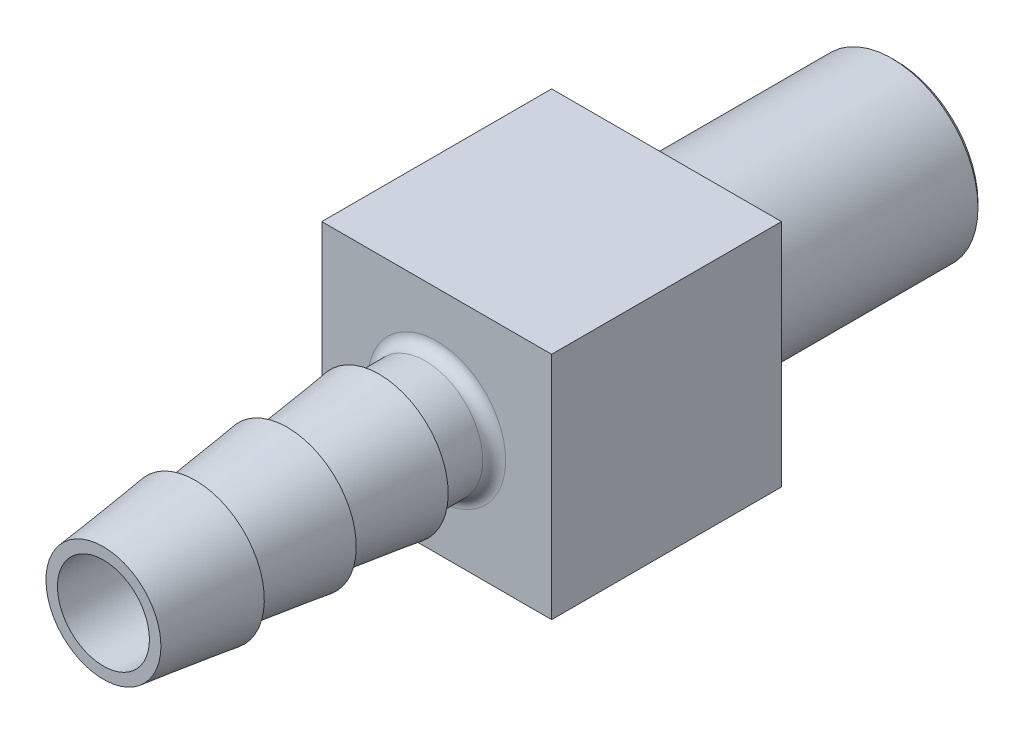
ISO-10303-21;
HEADER;
FILE_DESCRIPTION(('STEP AP214'),'2;1');
FILE_NAME('part.step','',(''),(''),'','','');
FILE_SCHEMA(('AUTOMOTIVE_DESIGN { 1 0 10303 214 1 1 1 1 }'));
ENDSEC;
DATA;
#1=APPLICATION_CONTEXT('core data for automotive mechanical design processes');
#2=APPLICATION_PROTOCOL_DEFINITION('international standard','automotive_design',2000,#1);
#3=PRODUCT_CONTEXT('',#1,'mechanical');
#4=PRODUCT('Part','Part','',(#3));
#5=PRODUCT_RELATED_PRODUCT_CATEGORY('part','',(#4));
#6=PRODUCT_DEFINITION_FORMATION('','',#4);
#7=PRODUCT_DEFINITION_CONTEXT('part definition',#1,'design');
#8=PRODUCT_DEFINITION('design','',#6,#7);
#9=PRODUCT_DEFINITION_SHAPE('','',#8);
#10=(LENGTH_UNIT() NAMED_UNIT(*) SI_UNIT(.MILLI.,.METRE.));
#11=(NAMED_UNIT(*) PLANE_ANGLE_UNIT() SI_UNIT($,.RADIAN.));
#12=(NAMED_UNIT(*) SI_UNIT($,.STERADIAN.) SOLID_ANGLE_UNIT());
#13=UNCERTAINTY_MEASURE_WITH_UNIT(LENGTH_MEASURE(1.E-05),#10,'distance_accuracy_value','');
#14=(GEOMETRIC_REPRESENTATION_CONTEXT(3) GLOBAL_UNCERTAINTY_ASSIGNED_CONTEXT((#13)) GLOBAL_UNIT_ASSIGNED_CONTEXT((#10,
#11,#12)) REPRESENTATION_CONTEXT('',''));
#15=CARTESIAN_POINT('',(0.,0.,0.));
#16=DIRECTION('',(0.,0.,1.));
#17=DIRECTION('',(1.,0.,0.));
#18=AXIS2_PLACEMENT_3D('',#15,#16,#17);
#19=CARTESIAN_POINT('',(0.,0.,12.7));
#20=DIRECTION('',(0.,0.,-1.));
#21=DIRECTION('',(-1.,0.,0.));
#22=AXIS2_PLACEMENT_3D('',#19,#20,#21);
#23=CYLINDRICAL_SURFACE('',#22,4.7625);
#24=CARTESIAN_POINT('',(0.,0.,12.065));
#25=DIRECTION('',(0.,0.,1.));
#26=DIRECTION('',(1.,0.,0.));
#27=AXIS2_PLACEMENT_3D('',#24,#25,#26);
#28=CIRCLE('',#27,4.7625);
#29=CARTESIAN_POINT('',(4.7625,0.,12.065));
#30=VERTEX_POINT('',#29);
#31=EDGE_CURVE('E11',#30,#30,#28,.F.);
#32=ORIENTED_EDGE('',*,*,#31,.T.);
#33=EDGE_LOOP('',(#32));
#34=FACE_BOUND('',#33,.T.);
#35=CARTESIAN_POINT('',(0.,0.,0.253999999999997));
#36=DIRECTION('',(0.,0.,1.));
#37=DIRECTION('',(1.,0.,0.));
#38=AXIS2_PLACEMENT_3D('',#35,#36,#37);
#39=CIRCLE('',#38,4.7625);
#40=CARTESIAN_POINT('',(4.7625,0.,0.253999999999997));
#41=VERTEX_POINT('',#40);
#42=EDGE_CURVE('E115',#41,#41,#39,.T.);
#43=ORIENTED_EDGE('',*,*,#42,.T.);
#44=EDGE_LOOP('',(#43));
#45=FACE_BOUND('',#44,.T.);
#46=ADVANCED_FACE('F36',(#34,#45),#23,.T.);
#47=CARTESIAN_POINT('',(0.,0.,0.));
#48=DIRECTION('',(0.,0.,1.));
#49=DIRECTION('',(1.,0.,0.));
#50=AXIS2_PLACEMENT_3D('',#47,#48,#49);
#51=PLANE('',#50);
#52=CARTESIAN_POINT('',(0.,0.,0.));
#53=DIRECTION('',(0.,0.,-1.));
#54=DIRECTION('',(-1.,0.,0.));
#55=AXIS2_PLACEMENT_3D('',#52,#53,#54);
#56=CIRCLE('',#55,3.175);
#57=CARTESIAN_POINT('',(-3.175,0.,0.));
#58=VERTEX_POINT('',#57);
#59=EDGE_CURVE('E316',#58,#58,#56,.T.);
#60=ORIENTED_EDGE('',*,*,#59,.F.);
#61=EDGE_LOOP('',(#60));
#62=FACE_BOUND('',#61,.T.);
#63=CARTESIAN_POINT('',(0.,0.,0.));
#64=DIRECTION('',(0.,0.,1.));
#65=DIRECTION('',(1.,0.,0.));
#66=AXIS2_PLACEMENT_3D('',#63,#64,#65);
#67=CIRCLE('',#66,4.5085);
#68=CARTESIAN_POINT('',(4.5085,0.,0.));
#69=VERTEX_POINT('',#68);
#70=EDGE_CURVE('E118',#69,#69,#67,.F.);
#71=ORIENTED_EDGE('',*,*,#70,.T.);
#72=EDGE_LOOP('',(#71));
#73=FACE_BOUND('',#72,.T.);
#74=ADVANCED_FACE('F148',(#62,#73),#51,.F.);
#75=CARTESIAN_POINT('',(0.,0.,0.253999999999997));
#76=DIRECTION('',(0.,0.,1.));
#77=DIRECTION('',(1.,0.,0.));
#78=AXIS2_PLACEMENT_3D('',#75,#76,#77);
#79=CONICAL_SURFACE('',#78,4.7625,0.785398163397453);
#80=ORIENTED_EDGE('',*,*,#70,.F.);
#81=EDGE_LOOP('',(#80));
#82=FACE_BOUND('',#81,.T.);
#83=ORIENTED_EDGE('',*,*,#42,.F.);
#84=EDGE_LOOP('',(#83));
#85=FACE_BOUND('',#84,.T.);
#86=ADVANCED_FACE('F154',(#82,#85),#79,.T.);
#87=CARTESIAN_POINT('',(-6.35,-6.35,12.7));
#88=DIRECTION('',(0.,0.,1.));
#89=DIRECTION('',(1.,0.,0.));
#90=AXIS2_PLACEMENT_3D('',#87,#88,#89);
#91=PLANE('',#90);
#92=CARTESIAN_POINT('',(0.,0.,12.7));
#93=DIRECTION('',(0.,0.,1.));
#94=DIRECTION('',(1.,0.,0.));
#95=AXIS2_PLACEMENT_3D('',#92,#93,#94);
#96=CIRCLE('',#95,5.3975);
#97=CARTESIAN_POINT('',(5.3975,0.,12.7));
#98=VERTEX_POINT('',#97);
#99=EDGE_CURVE('E46',#98,#98,#96,.T.);
#100=ORIENTED_EDGE('',*,*,#99,.T.);
#101=EDGE_LOOP('',(#100));
#102=FACE_BOUND('',#101,.T.);
#103=DIRECTION('',(0.,-1.,0.));
#104=VECTOR('',#103,1.);
#105=CARTESIAN_POINT('',(-6.35,6.35,12.7));
#106=LINE('',#105,#104);
#107=CARTESIAN_POINT('',(-6.35,6.35,12.7));
#108=VERTEX_POINT('',#107);
#109=CARTESIAN_POINT('',(-6.35,-6.35,12.7));
#110=VERTEX_POINT('',#109);
#111=EDGE_CURVE('E105',#108,#110,#106,.T.);
#112=ORIENTED_EDGE('',*,*,#111,.F.);
#113=DIRECTION('',(-1.,0.,0.));
#114=VECTOR('',#113,1.);
#115=CARTESIAN_POINT('',(-6.35,6.35,12.7));
#116=LINE('',#115,#114);
#117=CARTESIAN_POINT('',(6.35,6.35,12.7));
#118=VERTEX_POINT('',#117);
#119=EDGE_CURVE('E77',#118,#108,#116,.T.);
#120=ORIENTED_EDGE('',*,*,#119,.F.);
#121=DIRECTION('',(0.,1.,0.));
#122=VECTOR('',#121,1.);
#123=CARTESIAN_POINT('',(6.35,6.35,12.7));
#124=LINE('',#123,#122);
#125=CARTESIAN_POINT('',(6.35,-6.35,12.7));
#126=VERTEX_POINT('',#125);
#127=EDGE_CURVE('E71',#126,#118,#124,.T.);
#128=ORIENTED_EDGE('',*,*,#127,.F.);
#129=DIRECTION('',(1.,0.,0.));
#130=VECTOR('',#129,1.);
#131=CARTESIAN_POINT('',(-6.35,-6.35,12.7));
#132=LINE('',#131,#130);
#133=EDGE_CURVE('E95',#110,#126,#132,.T.);
#134=ORIENTED_EDGE('',*,*,#133,.F.);
#135=EDGE_LOOP('',(#112,#120,#128,#134));
#136=FACE_BOUND('',#135,.T.);
#137=ADVANCED_FACE('F130',(#102,#136),#91,.F.);
#138=CARTESIAN_POINT('',(-6.35,6.35,25.4));
#139=DIRECTION('',(1.,0.,0.));
#140=DIRECTION('',(0.,1.,0.));
#141=AXIS2_PLACEMENT_3D('',#138,#139,#140);
#142=PLANE('',#141);
#143=ORIENTED_EDGE('',*,*,#111,.T.);
#144=DIRECTION('',(0.,0.,-1.));
#145=VECTOR('',#144,1.);
#146=CARTESIAN_POINT('',(-6.35,-6.35,25.4));
#147=LINE('',#146,#145);
#148=CARTESIAN_POINT('',(-6.35,-6.35,25.4));
#149=VERTEX_POINT('',#148);
#150=EDGE_CURVE('E96',#149,#110,#147,.T.);
#151=ORIENTED_EDGE('',*,*,#150,.F.);
#152=DIRECTION('',(0.,-1.,0.));
#153=VECTOR('',#152,1.);
#154=CARTESIAN_POINT('',(-6.35,6.35,25.4));
#155=LINE('',#154,#153);
#156=CARTESIAN_POINT('',(-6.35,6.35,25.4));
#157=VERTEX_POINT('',#156);
#158=EDGE_CURVE('E90',#157,#149,#155,.T.);
#159=ORIENTED_EDGE('',*,*,#158,.F.);
#160=DIRECTION('',(0.,0.,-1.));
#161=VECTOR('',#160,1.);
#162=CARTESIAN_POINT('',(-6.35,6.35,25.4));
#163=LINE('',#162,#161);
#164=EDGE_CURVE('E101',#157,#108,#163,.T.);
#165=ORIENTED_EDGE('',*,*,#164,.T.);
#166=EDGE_LOOP('',(#143,#151,#159,#165));
#167=FACE_BOUND('',#166,.T.);
#168=ADVANCED_FACE('F165',(#167),#142,.F.);
#169=CARTESIAN_POINT('',(-6.35,-6.35,25.4));
#170=DIRECTION('',(0.,1.,0.));
#171=DIRECTION('',(0.,0.,1.));
#172=AXIS2_PLACEMENT_3D('',#169,#170,#171);
#173=PLANE('',#172);
#174=ORIENTED_EDGE('',*,*,#133,.T.);
#175=DIRECTION('',(0.,0.,-1.));
#176=VECTOR('',#175,1.);
#177=CARTESIAN_POINT('',(6.35,-6.35,25.4));
#178=LINE('',#177,#176);
#179=CARTESIAN_POINT('',(6.35,-6.35,25.4));
#180=VERTEX_POINT('',#179);
#181=EDGE_CURVE('E93',#180,#126,#178,.T.);
#182=ORIENTED_EDGE('',*,*,#181,.F.);
#183=DIRECTION('',(1.,0.,0.));
#184=VECTOR('',#183,1.);
#185=CARTESIAN_POINT('',(-6.35,-6.35,25.4));
#186=LINE('',#185,#184);
#187=EDGE_CURVE('E85',#149,#180,#186,.T.);
#188=ORIENTED_EDGE('',*,*,#187,.F.);
#189=ORIENTED_EDGE('',*,*,#150,.T.);
#190=EDGE_LOOP('',(#174,#182,#188,#189));
#191=FACE_BOUND('',#190,.T.);
#192=ADVANCED_FACE('F94',(#191),#173,.F.);
#193=CARTESIAN_POINT('',(6.35,6.35,25.4));
#194=DIRECTION('',(-1.,0.,0.));
#195=DIRECTION('',(0.,-1.,0.));
#196=AXIS2_PLACEMENT_3D('',#193,#194,#195);
#197=PLANE('',#196);
#198=ORIENTED_EDGE('',*,*,#127,.T.);
#199=DIRECTION('',(0.,0.,-1.));
#200=VECTOR('',#199,1.);
#201=CARTESIAN_POINT('',(6.35,6.35,25.4));
#202=LINE('',#201,#200);
#203=CARTESIAN_POINT('',(6.35,6.35,25.4));
#204=VERTEX_POINT('',#203);
#205=EDGE_CURVE('E97',#204,#118,#202,.T.);
#206=ORIENTED_EDGE('',*,*,#205,.F.);
#207=DIRECTION('',(0.,1.,0.));
#208=VECTOR('',#207,1.);
#209=CARTESIAN_POINT('',(6.35,6.35,25.4));
#210=LINE('',#209,#208);
#211=EDGE_CURVE('E88',#180,#204,#210,.T.);
#212=ORIENTED_EDGE('',*,*,#211,.F.);
#213=ORIENTED_EDGE('',*,*,#181,.T.);
#214=EDGE_LOOP('',(#198,#206,#212,#213));
#215=FACE_BOUND('',#214,.T.);
#216=ADVANCED_FACE('F99',(#215),#197,.F.);
#217=CARTESIAN_POINT('',(-6.35,6.35,25.4));
#218=DIRECTION('',(0.,-1.,0.));
#219=DIRECTION('',(0.,0.,-1.));
#220=AXIS2_PLACEMENT_3D('',#217,#218,#219);
#221=PLANE('',#220);
#222=ORIENTED_EDGE('',*,*,#119,.T.);
#223=ORIENTED_EDGE('',*,*,#164,.F.);
#224=DIRECTION('',(-1.,0.,0.));
#225=VECTOR('',#224,1.);
#226=CARTESIAN_POINT('',(-6.35,6.35,25.4));
#227=LINE('',#226,#225);
#228=EDGE_CURVE('E54',#204,#157,#227,.T.);
#229=ORIENTED_EDGE('',*,*,#228,.F.);
#230=ORIENTED_EDGE('',*,*,#205,.T.);
#231=EDGE_LOOP('',(#222,#223,#229,#230));
#232=FACE_BOUND('',#231,.T.);
#233=ADVANCED_FACE('F178',(#232),#221,.F.);
#234=CARTESIAN_POINT('',(-6.35,-6.35,25.4));
#235=DIRECTION('',(0.,0.,1.));
#236=DIRECTION('',(1.,0.,0.));
#237=AXIS2_PLACEMENT_3D('',#234,#235,#236);
#238=PLANE('',#237);
#239=CARTESIAN_POINT('',(0.,0.,25.4));
#240=DIRECTION('',(0.,0.,1.));
#241=DIRECTION('',(1.,0.,0.));
#242=AXIS2_PLACEMENT_3D('',#239,#240,#241);
#243=CIRCLE('',#242,3.81);
#244=CARTESIAN_POINT('',(3.81,0.,25.4));
#245=VERTEX_POINT('',#244);
#246=EDGE_CURVE('E124',#245,#245,#243,.F.);
#247=ORIENTED_EDGE('',*,*,#246,.T.);
#248=EDGE_LOOP('',(#247));
#249=FACE_BOUND('',#248,.T.);
#250=ORIENTED_EDGE('',*,*,#158,.T.);
#251=ORIENTED_EDGE('',*,*,#187,.T.);
#252=ORIENTED_EDGE('',*,*,#211,.T.);
#253=ORIENTED_EDGE('',*,*,#228,.T.);
#254=EDGE_LOOP('',(#250,#251,#252,#253));
#255=FACE_BOUND('',#254,.T.);
#256=ADVANCED_FACE('F86',(#249,#255),#238,.T.);
#257=CARTESIAN_POINT('',(0.,0.,19.05));
#258=DIRECTION('',(0.,0.,-1.));
#259=DIRECTION('',(0.,1.,0.));
#260=AXIS2_PLACEMENT_3D('',#257,#258,#259);
#261=CYLINDRICAL_SURFACE('',#260,3.175);
#262=CARTESIAN_POINT('',(0.,0.,26.035));
#263=DIRECTION('',(0.,0.,1.));
#264=DIRECTION('',(1.,0.,0.));
#265=AXIS2_PLACEMENT_3D('',#262,#263,#264);
#266=CIRCLE('',#265,3.175);
#267=CARTESIAN_POINT('',(3.175,0.,26.035));
#268=VERTEX_POINT('',#267);
#269=EDGE_CURVE('E121',#268,#268,#266,.T.);
#270=ORIENTED_EDGE('',*,*,#269,.T.);
#271=EDGE_LOOP('',(#270));
#272=FACE_BOUND('',#271,.T.);
#273=CARTESIAN_POINT('',(0.,0.,28.575));
#274=DIRECTION('',(0.,0.,-1.));
#275=DIRECTION('',(0.,1.,0.));
#276=AXIS2_PLACEMENT_3D('',#273,#274,#275);
#277=CIRCLE('',#276,3.175);
#278=CARTESIAN_POINT('',(0.,3.175,28.575));
#279=VERTEX_POINT('',#278);
#280=EDGE_CURVE('E108',#279,#279,#277,.T.);
#281=ORIENTED_EDGE('',*,*,#280,.T.);
#282=EDGE_LOOP('',(#281));
#283=FACE_BOUND('',#282,.T.);
#284=ADVANCED_FACE('F203',(#272,#283),#261,.T.);
#285=CARTESIAN_POINT('',(0.,3.175,28.575));
#286=DIRECTION('',(0.,0.,-1.));
#287=DIRECTION('',(0.,1.,0.));
#288=AXIS2_PLACEMENT_3D('',#285,#286,#287);
#289=PLANE('',#288);
#290=CARTESIAN_POINT('',(0.,0.,28.575));
#291=DIRECTION('',(0.,0.,-1.));
#292=DIRECTION('',(0.,1.,0.));
#293=AXIS2_PLACEMENT_3D('',#290,#291,#292);
#294=CIRCLE('',#293,3.81);
#295=CARTESIAN_POINT('',(0.,3.81,28.575));
#296=VERTEX_POINT('',#295);
#297=EDGE_CURVE('E338',#296,#296,#294,.T.);
#298=ORIENTED_EDGE('',*,*,#297,.T.);
#299=EDGE_LOOP('',(#298));
#300=FACE_BOUND('',#299,.T.);
#301=ORIENTED_EDGE('',*,*,#280,.F.);
#302=EDGE_LOOP('',(#301));
#303=FACE_BOUND('',#302,.T.);
#304=ADVANCED_FACE('F210',(#300,#303),#289,.T.);
#305=CARTESIAN_POINT('',(0.,0.,28.575));
#306=DIRECTION('',(0.,0.,-1.));
#307=DIRECTION('',(0.,1.,0.));
#308=AXIS2_PLACEMENT_3D('',#305,#306,#307);
#309=CONICAL_SURFACE('',#308,3.81,0.124354994546762);
#310=CARTESIAN_POINT('',(0.,0.,33.655));
#311=DIRECTION('',(0.,0.,-1.));
#312=DIRECTION('',(0.,1.,0.));
#313=AXIS2_PLACEMENT_3D('',#310,#311,#312);
#314=CIRCLE('',#313,3.175);
#315=CARTESIAN_POINT('',(0.,3.175,33.655));
#316=VERTEX_POINT('',#315);
#317=EDGE_CURVE('E335',#316,#316,#314,.T.);
#318=ORIENTED_EDGE('',*,*,#317,.T.);
#319=EDGE_LOOP('',(#318));
#320=FACE_BOUND('',#319,.T.);
#321=ORIENTED_EDGE('',*,*,#297,.F.);
#322=EDGE_LOOP('',(#321));
#323=FACE_BOUND('',#322,.T.);
#324=ADVANCED_FACE('F217',(#320,#323),#309,.T.);
#325=CARTESIAN_POINT('',(0.,3.175,33.655));
#326=DIRECTION('',(0.,0.,-1.));
#327=DIRECTION('',(0.,1.,0.));
#328=AXIS2_PLACEMENT_3D('',#325,#326,#327);
#329=PLANE('',#328);
#330=CARTESIAN_POINT('',(0.,0.,33.655));
#331=DIRECTION('',(0.,0.,-1.));
#332=DIRECTION('',(0.,1.,0.));
#333=AXIS2_PLACEMENT_3D('',#330,#331,#332);
#334=CIRCLE('',#333,3.81);
#335=CARTESIAN_POINT('',(0.,3.81,33.655));
#336=VERTEX_POINT('',#335);
#337=EDGE_CURVE('E332',#336,#336,#334,.T.);
#338=ORIENTED_EDGE('',*,*,#337,.T.);
#339=EDGE_LOOP('',(#338));
#340=FACE_BOUND('',#339,.T.);
#341=ORIENTED_EDGE('',*,*,#317,.F.);
#342=EDGE_LOOP('',(#341));
#343=FACE_BOUND('',#342,.T.);
#344=ADVANCED_FACE('F225',(#340,#343),#329,.T.);
#345=CARTESIAN_POINT('',(0.,0.,33.655));
#346=DIRECTION('',(0.,0.,-1.));
#347=DIRECTION('',(0.,1.,0.));
#348=AXIS2_PLACEMENT_3D('',#345,#346,#347);
#349=CONICAL_SURFACE('',#348,3.81,0.124354994546762);
#350=CARTESIAN_POINT('',(0.,0.,38.735));
#351=DIRECTION('',(0.,0.,-1.));
#352=DIRECTION('',(0.,1.,0.));
#353=AXIS2_PLACEMENT_3D('',#350,#351,#352);
#354=CIRCLE('',#353,3.175);
#355=CARTESIAN_POINT('',(0.,3.175,38.735));
#356=VERTEX_POINT('',#355);
#357=EDGE_CURVE('E329',#356,#356,#354,.T.);
#358=ORIENTED_EDGE('',*,*,#357,.T.);
#359=EDGE_LOOP('',(#358));
#360=FACE_BOUND('',#359,.T.);
#361=ORIENTED_EDGE('',*,*,#337,.F.);
#362=EDGE_LOOP('',(#361));
#363=FACE_BOUND('',#362,.T.);
#364=ADVANCED_FACE('F233',(#360,#363),#349,.T.);
#365=CARTESIAN_POINT('',(0.,3.175,38.735));
#366=DIRECTION('',(0.,0.,-1.));
#367=DIRECTION('',(0.,1.,0.));
#368=AXIS2_PLACEMENT_3D('',#365,#366,#367);
#369=PLANE('',#368);
#370=CARTESIAN_POINT('',(0.,0.,38.735));
#371=DIRECTION('',(0.,0.,-1.));
#372=DIRECTION('',(0.,1.,0.));
#373=AXIS2_PLACEMENT_3D('',#370,#371,#372);
#374=CIRCLE('',#373,3.81);
#375=CARTESIAN_POINT('',(0.,3.81,38.735));
#376=VERTEX_POINT('',#375);
#377=EDGE_CURVE('E326',#376,#376,#374,.T.);
#378=ORIENTED_EDGE('',*,*,#377,.T.);
#379=EDGE_LOOP('',(#378));
#380=FACE_BOUND('',#379,.T.);
#381=ORIENTED_EDGE('',*,*,#357,.F.);
#382=EDGE_LOOP('',(#381));
#383=FACE_BOUND('',#382,.T.);
#384=ADVANCED_FACE('F241',(#380,#383),#369,.T.);
#385=CARTESIAN_POINT('',(0.,0.,38.735));
#386=DIRECTION('',(0.,0.,-1.));
#387=DIRECTION('',(0.,1.,0.));
#388=AXIS2_PLACEMENT_3D('',#385,#386,#387);
#389=CONICAL_SURFACE('',#388,3.81,0.124354994546762);
#390=CARTESIAN_POINT('',(0.,0.,43.815));
#391=DIRECTION('',(0.,0.,-1.));
#392=DIRECTION('',(0.,1.,0.));
#393=AXIS2_PLACEMENT_3D('',#390,#391,#392);
#394=CIRCLE('',#393,3.175);
#395=CARTESIAN_POINT('',(0.,3.175,43.815));
#396=VERTEX_POINT('',#395);
#397=EDGE_CURVE('E321',#396,#396,#394,.T.);
#398=ORIENTED_EDGE('',*,*,#397,.T.);
#399=EDGE_LOOP('',(#398));
#400=FACE_BOUND('',#399,.T.);
#401=ORIENTED_EDGE('',*,*,#377,.F.);
#402=EDGE_LOOP('',(#401));
#403=FACE_BOUND('',#402,.T.);
#404=ADVANCED_FACE('F249',(#400,#403),#389,.T.);
#405=CARTESIAN_POINT('',(0.,3.175,43.815));
#406=DIRECTION('',(0.,0.,1.));
#407=DIRECTION('',(0.,-1.,0.));
#408=AXIS2_PLACEMENT_3D('',#405,#406,#407);
#409=PLANE('',#408);
#410=CARTESIAN_POINT('',(0.,0.,43.815));
#411=DIRECTION('',(0.,0.,1.));
#412=DIRECTION('',(1.,0.,0.));
#413=AXIS2_PLACEMENT_3D('',#410,#411,#412);
#414=CIRCLE('',#413,2.54);
#415=CARTESIAN_POINT('',(2.54,0.,43.815));
#416=VERTEX_POINT('',#415);
#417=EDGE_CURVE('E314',#416,#416,#414,.T.);
#418=ORIENTED_EDGE('',*,*,#417,.F.);
#419=EDGE_LOOP('',(#418));
#420=FACE_BOUND('',#419,.T.);
#421=ORIENTED_EDGE('',*,*,#397,.F.);
#422=EDGE_LOOP('',(#421));
#423=FACE_BOUND('',#422,.T.);
#424=ADVANCED_FACE('F144',(#420,#423),#409,.T.);
#425=CARTESIAN_POINT('',(0.,0.,26.035));
#426=DIRECTION('',(0.,0.,1.));
#427=DIRECTION('',(1.,0.,0.));
#428=AXIS2_PLACEMENT_3D('',#425,#426,#427);
#429=TOROIDAL_SURFACE('',#428,3.81,0.635);
#430=ORIENTED_EDGE('',*,*,#246,.F.);
#431=EDGE_LOOP('',(#430));
#432=FACE_BOUND('',#431,.T.);
#433=ORIENTED_EDGE('',*,*,#269,.F.);
#434=EDGE_LOOP('',(#433));
#435=FACE_BOUND('',#434,.T.);
#436=ADVANCED_FACE('F135',(#432,#435),#429,.F.);
#437=CARTESIAN_POINT('',(0.,0.,12.065));
#438=DIRECTION('',(0.,0.,1.));
#439=DIRECTION('',(1.,0.,0.));
#440=AXIS2_PLACEMENT_3D('',#437,#438,#439);
#441=TOROIDAL_SURFACE('',#440,5.3975,0.635);
#442=ORIENTED_EDGE('',*,*,#31,.F.);
#443=EDGE_LOOP('',(#442));
#444=FACE_BOUND('',#443,.T.);
#445=ORIENTED_EDGE('',*,*,#99,.F.);
#446=EDGE_LOOP('',(#445));
#447=FACE_BOUND('',#446,.T.);
#448=ADVANCED_FACE('F38',(#444,#447),#441,.F.);
#449=CARTESIAN_POINT('',(0.,0.,20.32));
#450=DIRECTION('',(0.,0.,-1.));
#451=DIRECTION('',(-1.,0.,0.));
#452=AXIS2_PLACEMENT_3D('',#449,#450,#451);
#453=CYLINDRICAL_SURFACE('',#452,3.175);
#454=CARTESIAN_POINT('',(0.,0.,20.32));
#455=DIRECTION('',(0.,0.,-1.));
#456=DIRECTION('',(-1.,0.,0.));
#457=AXIS2_PLACEMENT_3D('',#454,#455,#456);
#458=CIRCLE('',#457,3.175);
#459=CARTESIAN_POINT('',(-3.175,0.,20.32));
#460=VERTEX_POINT('',#459);
#461=EDGE_CURVE('E318',#460,#460,#458,.T.);
#462=ORIENTED_EDGE('',*,*,#461,.F.);
#463=EDGE_LOOP('',(#462));
#464=FACE_BOUND('',#463,.T.);
#465=ORIENTED_EDGE('',*,*,#59,.T.);
#466=EDGE_LOOP('',(#465));
#467=FACE_BOUND('',#466,.T.);
#468=ADVANCED_FACE('F134',(#464,#467),#453,.F.);
#469=CARTESIAN_POINT('',(0.,0.,20.32));
#470=DIRECTION('',(0.,0.,-1.));
#471=DIRECTION('',(-1.,0.,0.));
#472=AXIS2_PLACEMENT_3D('',#469,#470,#471);
#473=PLANE('',#472);
#474=CARTESIAN_POINT('',(0.,0.,20.32));
#475=DIRECTION('',(0.,0.,-1.));
#476=DIRECTION('',(-1.,0.,0.));
#477=AXIS2_PLACEMENT_3D('',#474,#475,#476);
#478=CIRCLE('',#477,2.54);
#479=CARTESIAN_POINT('',(-2.54,0.,20.32));
#480=VERTEX_POINT('',#479);
#481=EDGE_CURVE('E40',#480,#480,#478,.T.);
#482=ORIENTED_EDGE('',*,*,#481,.F.);
#483=EDGE_LOOP('',(#482));
#484=FACE_BOUND('',#483,.T.);
#485=ORIENTED_EDGE('',*,*,#461,.T.);
#486=EDGE_LOOP('',(#485));
#487=FACE_BOUND('',#486,.T.);
#488=ADVANCED_FACE('F141',(#484,#487),#473,.T.);
#489=CARTESIAN_POINT('',(0.,0.,19.939));
#490=DIRECTION('',(0.,0.,1.));
#491=DIRECTION('',(1.,0.,0.));
#492=AXIS2_PLACEMENT_3D('',#489,#490,#491);
#493=CYLINDRICAL_SURFACE('',#492,2.54);
#494=ORIENTED_EDGE('',*,*,#481,.T.);
#495=EDGE_LOOP('',(#494));
#496=FACE_BOUND('',#495,.T.);
#497=ORIENTED_EDGE('',*,*,#417,.T.);
#498=EDGE_LOOP('',(#497));
#499=FACE_BOUND('',#498,.T.);
#500=ADVANCED_FACE('F295',(#496,#499),#493,.F.);
#501=CLOSED_SHELL('',(#46,#74,#86,#137,#168,#192,#216,#233,#256,#284,#304,#324,#344,#364,#384,
#404,#424,#436,#448,#468,#488,#500));
#502=MANIFOLD_SOLID_BREP('B2',#501);
#503=ADVANCED_BREP_SHAPE_REPRESENTATION('',(#18,#502),#14);
#504=SHAPE_DEFINITION_REPRESENTATION(#9,#503);
ENDSEC;
END-ISO-10303-21;
